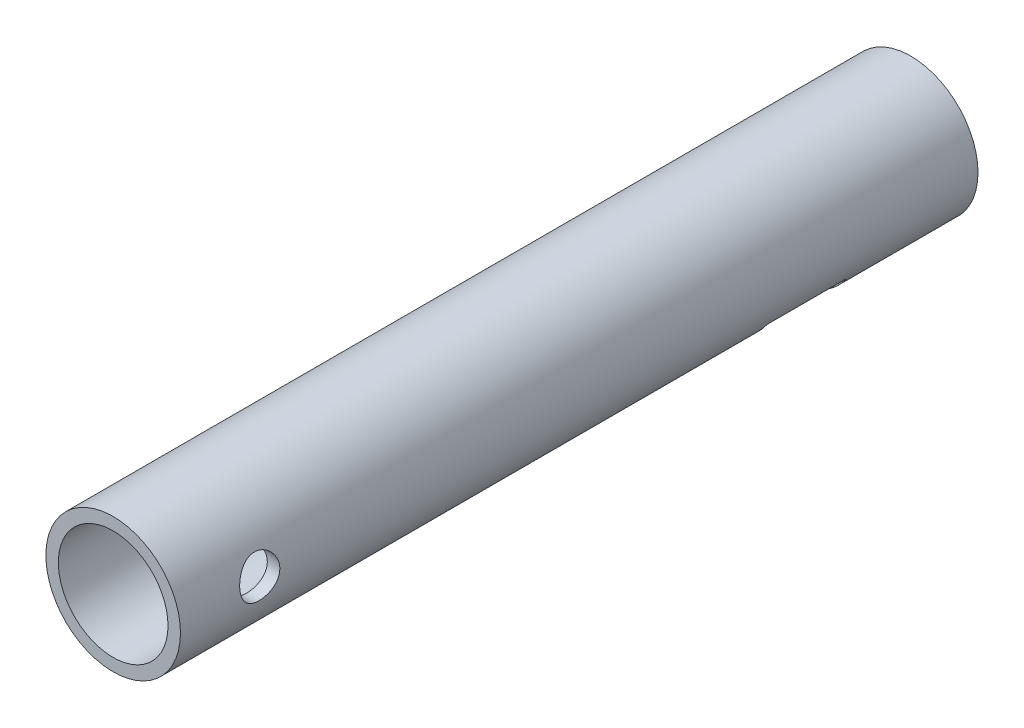
ISO-10303-21;
HEADER;
FILE_DESCRIPTION(('STEP AP214'),'2;1');
FILE_NAME('part.step','',(''),(''),'','','');
FILE_SCHEMA(('AUTOMOTIVE_DESIGN { 1 0 10303 214 1 1 1 1 }'));
ENDSEC;
DATA;
#1=APPLICATION_CONTEXT('core data for automotive mechanical design processes');
#2=APPLICATION_PROTOCOL_DEFINITION('international standard','automotive_design',2000,#1);
#3=PRODUCT_CONTEXT('',#1,'mechanical');
#4=PRODUCT('Part','Part','',(#3));
#5=PRODUCT_RELATED_PRODUCT_CATEGORY('part','',(#4));
#6=PRODUCT_DEFINITION_FORMATION('','',#4);
#7=PRODUCT_DEFINITION_CONTEXT('part definition',#1,'design');
#8=PRODUCT_DEFINITION('design','',#6,#7);
#9=PRODUCT_DEFINITION_SHAPE('','',#8);
#10=(LENGTH_UNIT() NAMED_UNIT(*) SI_UNIT(.MILLI.,.METRE.));
#11=(NAMED_UNIT(*) PLANE_ANGLE_UNIT() SI_UNIT($,.RADIAN.));
#12=(NAMED_UNIT(*) SI_UNIT($,.STERADIAN.) SOLID_ANGLE_UNIT());
#13=UNCERTAINTY_MEASURE_WITH_UNIT(LENGTH_MEASURE(1.E-05),#10,'distance_accuracy_value','');
#14=(GEOMETRIC_REPRESENTATION_CONTEXT(3) GLOBAL_UNCERTAINTY_ASSIGNED_CONTEXT((#13)) GLOBAL_UNIT_ASSIGNED_CONTEXT((#10,
#11,#12)) REPRESENTATION_CONTEXT('',''));
#15=CARTESIAN_POINT('',(0.,0.,0.));
#16=DIRECTION('',(0.,0.,1.));
#17=DIRECTION('',(1.,0.,0.));
#18=AXIS2_PLACEMENT_3D('',#15,#16,#17);
#19=CARTESIAN_POINT('',(0.,0.,127.));
#20=DIRECTION('',(0.,0.,1.));
#21=DIRECTION('',(1.,0.,0.));
#22=AXIS2_PLACEMENT_3D('',#19,#20,#21);
#23=PLANE('',#22);
#24=CARTESIAN_POINT('',(0.,0.,127.));
#25=DIRECTION('',(0.,0.,1.));
#26=DIRECTION('',(1.,0.,0.));
#27=AXIS2_PLACEMENT_3D('',#24,#25,#26);
#28=CIRCLE('',#27,10.715625);
#29=CARTESIAN_POINT('',(10.715625,0.,127.));
#30=VERTEX_POINT('',#29);
#31=EDGE_CURVE('E146',#30,#30,#28,.T.);
#32=ORIENTED_EDGE('',*,*,#31,.T.);
#33=EDGE_LOOP('',(#32));
#34=FACE_BOUND('',#33,.T.);
#35=CARTESIAN_POINT('',(0.,0.,127.));
#36=DIRECTION('',(0.,0.,1.));
#37=DIRECTION('',(1.,0.,0.));
#38=AXIS2_PLACEMENT_3D('',#35,#36,#37);
#39=CIRCLE('',#38,8.73125);
#40=CARTESIAN_POINT('',(8.73125,0.,127.));
#41=VERTEX_POINT('',#40);
#42=EDGE_CURVE('E140',#41,#41,#39,.T.);
#43=ORIENTED_EDGE('',*,*,#42,.F.);
#44=EDGE_LOOP('',(#43));
#45=FACE_BOUND('',#44,.T.);
#46=ADVANCED_FACE('F33',(#34,#45),#23,.T.);
#47=CARTESIAN_POINT('',(0.,0.,0.));
#48=DIRECTION('',(0.,0.,1.));
#49=DIRECTION('',(1.,0.,0.));
#50=AXIS2_PLACEMENT_3D('',#47,#48,#49);
#51=PLANE('',#50);
#52=CARTESIAN_POINT('',(0.,0.,0.));
#53=DIRECTION('',(0.,0.,1.));
#54=DIRECTION('',(1.,0.,0.));
#55=AXIS2_PLACEMENT_3D('',#52,#53,#54);
#56=CIRCLE('',#55,10.715625);
#57=CARTESIAN_POINT('',(10.715625,0.,0.));
#58=VERTEX_POINT('',#57);
#59=EDGE_CURVE('E143',#58,#58,#56,.T.);
#60=ORIENTED_EDGE('',*,*,#59,.F.);
#61=EDGE_LOOP('',(#60));
#62=FACE_BOUND('',#61,.T.);
#63=CARTESIAN_POINT('',(0.,0.,0.));
#64=DIRECTION('',(0.,0.,1.));
#65=DIRECTION('',(1.,0.,0.));
#66=AXIS2_PLACEMENT_3D('',#63,#64,#65);
#67=CIRCLE('',#66,8.73125);
#68=CARTESIAN_POINT('',(8.73125,0.,0.));
#69=VERTEX_POINT('',#68);
#70=EDGE_CURVE('E139',#69,#69,#67,.T.);
#71=ORIENTED_EDGE('',*,*,#70,.T.);
#72=EDGE_LOOP('',(#71));
#73=FACE_BOUND('',#72,.T.);
#74=ADVANCED_FACE('F196',(#62,#73),#51,.F.);
#75=CARTESIAN_POINT('',(0.,0.,127.));
#76=DIRECTION('',(0.,0.,-1.));
#77=DIRECTION('',(-1.,0.,0.));
#78=AXIS2_PLACEMENT_3D('',#75,#76,#77);
#79=CYLINDRICAL_SURFACE('',#78,10.715625);
#80=CARTESIAN_POINT('',(-10.715625,0.,117.243303774566));
#81=CARTESIAN_POINT('',(-10.7156241985774,-0.164005580794668,117.176957069357));
#82=CARTESIAN_POINT('',(-10.7118297163916,-0.322479936848455,117.096852098421));
#83=CARTESIAN_POINT('',(-10.6985206978598,-0.623760945674024,116.91150296186));
#84=CARTESIAN_POINT('',(-10.6890031492187,-0.766559300655177,116.806245575036));
#85=CARTESIAN_POINT('',(-10.6666121011843,-1.03237755156086,116.573768851958));
#86=CARTESIAN_POINT('',(-10.6537424401657,-1.15541981062583,116.446574690577));
#87=CARTESIAN_POINT('',(-10.6271610594934,-1.37867229506016,116.173613362715));
#88=CARTESIAN_POINT('',(-10.613449367351,-1.47888326587963,116.027846802872));
#89=CARTESIAN_POINT('',(-10.5874219168771,-1.65504970319443,115.719415962728));
#90=CARTESIAN_POINT('',(-10.5751287820095,-1.73063998281286,115.556540867311));
#91=CARTESIAN_POINT('',(-10.554312821636,-1.85337649886274,115.220175881309));
#92=CARTESIAN_POINT('',(-10.5457896952211,-1.90052500552782,115.046686839151));
#93=CARTESIAN_POINT('',(-10.5340294183002,-1.96466613249943,114.69544937312));
#94=CARTESIAN_POINT('',(-10.530751274355,-1.98189270667268,114.517745108408));
#95=CARTESIAN_POINT('',(-10.5299103946145,-1.98635711248558,114.161954622028));
#96=CARTESIAN_POINT('',(-10.5323472574381,-1.97359705017064,113.983868428061));
#97=CARTESIAN_POINT('',(-10.5424535052871,-1.91886361507665,113.634775581819));
#98=CARTESIAN_POINT('',(-10.5500549179061,-1.87726959315232,113.463707207204));
#99=CARTESIAN_POINT('',(-10.5691599498105,-1.76652512855174,113.130965861184));
#100=CARTESIAN_POINT('',(-10.5806639230973,-1.69737218590556,112.969293743672));
#101=CARTESIAN_POINT('',(-10.6057874217165,-1.53260554061405,112.658059833053));
#102=CARTESIAN_POINT('',(-10.6194277201464,-1.43672391725184,112.508641602656));
#103=CARTESIAN_POINT('',(-10.6463376423025,-1.22141455095845,112.227802539442));
#104=CARTESIAN_POINT('',(-10.6596072314099,-1.10198461728953,112.096383383037));
#105=CARTESIAN_POINT('',(-10.6833606587824,-0.841259986641432,111.853750990315));
#106=CARTESIAN_POINT('',(-10.6938109921598,-0.699731411092446,111.742785352109));
#107=CARTESIAN_POINT('',(-10.709215961757,-0.399774751542727,111.546203770478));
#108=CARTESIAN_POINT('',(-10.7141714393202,-0.241349258782689,111.460583947708));
#109=CARTESIAN_POINT('',(-10.7165069838976,0.0847977145378336,111.318585039758));
#110=CARTESIAN_POINT('',(-10.7140209650604,0.252302233877439,111.26171032528));
#111=CARTESIAN_POINT('',(-10.7005092825232,0.594084708564561,111.176577623808));
#112=CARTESIAN_POINT('',(-10.689485156274,0.768361439079026,111.148314486863));
#113=CARTESIAN_POINT('',(-10.6589186530186,1.11422933910506,111.121294076534));
#114=CARTESIAN_POINT('',(-10.6395842808478,1.28578630997922,111.121853606921));
#115=CARTESIAN_POINT('',(-10.5930050024699,1.62550702645259,111.150306788304));
#116=CARTESIAN_POINT('',(-10.5657595077408,1.79367051860939,111.178202473251));
#117=CARTESIAN_POINT('',(-10.5042281647614,2.12476067371002,111.26066281959));
#118=CARTESIAN_POINT('',(-10.4698412948703,2.2875683789566,111.315627664323));
#119=CARTESIAN_POINT('',(-10.3963262929359,2.601350395268,111.450497351538));
#120=CARTESIAN_POINT('',(-10.3571968663043,2.7523214566474,111.530409013241));
#121=CARTESIAN_POINT('',(-10.2746494733951,3.04642417890097,111.717647616606));
#122=CARTESIAN_POINT('',(-10.231114639436,3.18876881951864,111.826160345627));
#123=CARTESIAN_POINT('',(-10.1448415972497,3.45343593700421,112.065680293023));
#124=CARTESIAN_POINT('',(-10.1021036531434,3.5757518765387,112.196694827474));
#125=CARTESIAN_POINT('',(-10.0198737612212,3.80018962209496,112.482134456363));
#126=CARTESIAN_POINT('',(-9.980501479454,3.90167283093683,112.637098673707));
#127=CARTESIAN_POINT('',(-9.91028979071552,4.07672921315628,112.963836634003));
#128=CARTESIAN_POINT('',(-9.87944668631345,4.15031448554374,113.135603049284));
#129=CARTESIAN_POINT('',(-9.83106627740892,4.26361217929916,113.482125548724));
#130=CARTESIAN_POINT('',(-9.81294155729113,4.30483229148096,113.656304244579));
#131=CARTESIAN_POINT('',(-9.7897222546154,4.35738728496238,114.009928529772));
#132=CARTESIAN_POINT('',(-9.78461995146149,4.36873987393354,114.189370934552));
#133=CARTESIAN_POINT('',(-9.78792222258104,4.36132744271024,114.533901101351));
#134=CARTESIAN_POINT('',(-9.79533757607064,4.34476832443281,114.699051234494));
#135=CARTESIAN_POINT('',(-9.82102084183149,4.28639376310044,115.023935363059));
#136=CARTESIAN_POINT('',(-9.83928938063137,4.24457686197131,115.183669045239));
#137=CARTESIAN_POINT('',(-9.88489138772368,4.1372588272953,115.493702235801));
#138=CARTESIAN_POINT('',(-9.91223317076353,4.07173596454674,115.643992939805));
#139=CARTESIAN_POINT('',(-9.97355617533892,3.91912498019044,115.931702787427));
#140=CARTESIAN_POINT('',(-10.0075394000351,3.83203035008255,116.069118029061));
#141=CARTESIAN_POINT('',(-10.0821488404631,3.63141099195491,116.337976968128));
#142=CARTESIAN_POINT('',(-10.1230798766,3.51641294586824,116.468237073853));
#143=CARTESIAN_POINT('',(-10.2062987748946,3.26701098312701,116.708155032649));
#144=CARTESIAN_POINT('',(-10.2485871258412,3.13260001320419,116.817805364133));
#145=CARTESIAN_POINT('',(-10.3338275952269,2.83922947904785,117.019592249049));
#146=CARTESIAN_POINT('',(-10.3766809066944,2.67930902510741,117.110379707206));
#147=CARTESIAN_POINT('',(-10.4572749421912,2.34510738405432,117.263368757677));
#148=CARTESIAN_POINT('',(-10.4950158908494,2.17082682844276,117.325571606239));
#149=CARTESIAN_POINT('',(-10.5621850465784,1.81574757343737,117.418160471105));
#150=CARTESIAN_POINT('',(-10.5917448031183,1.63511207393768,117.44907421632));
#151=CARTESIAN_POINT('',(-10.641687655936,1.27002521673559,117.47927803233));
#152=CARTESIAN_POINT('',(-10.6620775001128,1.08557676977439,117.478591395597));
#153=CARTESIAN_POINT('',(-10.690615869301,0.747939102896874,117.447807679126));
#154=CARTESIAN_POINT('',(-10.7001919495098,0.594426913755052,117.422387071235));
#155=CARTESIAN_POINT('',(-10.7126967562218,0.292519442469018,117.349286658032));
#156=CARTESIAN_POINT('',(-10.71562570427,0.144123989949184,117.301607594646));
#157=CARTESIAN_POINT('',(-10.715625,0.,117.243303774566));
#158=B_SPLINE_CURVE_WITH_KNOTS('',3,(#80,#81,#82,#83,#84,#85,#86,#87,#88,#89,#90,#91,#92,#93,
#94,#95,#96,#97,#98,#99,#100,#101,#102,#103,#104,#105,#106,#107,#108,#109,#110,#111,#112,#113,
#114,#115,#116,#117,#118,#119,#120,#121,#122,#123,#124,#125,#126,#127,#128,#129,#130,#131,#132,
#133,#134,#135,#136,#137,#138,#139,#140,#141,#142,#143,#144,#145,#146,#147,#148,#149,#150,#151,
#152,#153,#154,#155,#156,#157),.UNSPECIFIED.,.T.,.F.,(4,2,2,2,2,2,2,2,2,2,2,2,2,2,2,2,2,2,2,2,2,
2,2,2,2,2,2,2,2,2,2,2,2,2,2,2,2,2,4),(0.,0.53017381019819,1.06062691813643,1.5904752746858,
2.12030632900758,2.65767177845071,3.19499432949236,3.72809642213632,4.26116107464706,
4.78734241319247,5.31357149442992,5.84527774083405,6.37703347609704,6.91485515450411,
7.45259447309401,7.98071537501116,8.50874120068148,9.0242568938436,9.53981094692406,
10.0632265790751,10.586785412541,11.1369224344399,11.6872386637184,12.2524993544245,
12.8175146169629,13.3543214833164,13.8908100191562,14.3868553373004,14.8829292937465,
15.3794591150304,15.8761389291011,16.4093689397743,16.9427931777571,17.5065257792397,
18.0702336031855,18.6242668967324,19.1778918218548,19.6438107946878,20.1097142384736),.UNSPECIFIED.);
#159=CARTESIAN_POINT('',(-10.715625,0.,117.243303774566));
#160=VERTEX_POINT('',#159);
#161=EDGE_CURVE('E118',#160,#160,#158,.T.);
#162=ORIENTED_EDGE('',*,*,#161,.T.);
#163=EDGE_LOOP('',(#162));
#164=FACE_BOUND('',#163,.T.);
#165=CARTESIAN_POINT('',(10.6492737428427,1.190625,111.125));
#166=CARTESIAN_POINT('',(10.6684597795728,1.01902389291595,111.124999816036));
#167=CARTESIAN_POINT('',(10.6834603351592,0.846951327018768,111.138953388063));
#168=CARTESIAN_POINT('',(10.704988617735,0.506831504453065,111.194723031247));
#169=CARTESIAN_POINT('',(10.7115163878406,0.338784227304908,111.236538960617));
#170=CARTESIAN_POINT('',(10.71686747514,0.0117033823030918,111.3469417703));
#171=CARTESIAN_POINT('',(10.7156944095821,-0.147334382108545,111.415516067396));
#172=CARTESIAN_POINT('',(10.7071725646237,-0.452037946538933,111.577489146024));
#173=CARTESIAN_POINT('',(10.699822928326,-0.597701888050279,111.670891370791));
#174=CARTESIAN_POINT('',(10.6808866815742,-0.87326241479311,111.881044793832));
#175=CARTESIAN_POINT('',(10.669255155706,-1.00297166039658,111.998037336438));
#176=CARTESIAN_POINT('',(10.644148559628,-1.24142105145872,112.251568485501));
#177=CARTESIAN_POINT('',(10.6306732504656,-1.35015847457914,112.388109625545));
#178=CARTESIAN_POINT('',(10.6039428551835,-1.54631578920649,112.680864221433));
#179=CARTESIAN_POINT('',(10.590702024935,-1.63312499795554,112.837488819062));
#180=CARTESIAN_POINT('',(10.5671322804776,-1.77928237848225,113.163273945758));
#181=CARTESIAN_POINT('',(10.5568032623005,-1.8386315307884,113.332434026966));
#182=CARTESIAN_POINT('',(10.5408501907935,-1.92799763261565,113.678200709895));
#183=CARTESIAN_POINT('',(10.5352168176278,-1.95807270483874,113.854791826877));
#184=CARTESIAN_POINT('',(10.5295865331726,-1.98813260562761,114.210596823416));
#185=CARTESIAN_POINT('',(10.5295890365202,-1.98812055915212,114.389810428659));
#186=CARTESIAN_POINT('',(10.5351832984706,-1.95825037575942,114.742843944138));
#187=CARTESIAN_POINT('',(10.5406889307776,-1.92885214474069,114.91670441381));
#188=CARTESIAN_POINT('',(10.5562446049504,-1.84180721537006,115.256989084194));
#189=CARTESIAN_POINT('',(10.5662949384738,-1.78415870402778,115.423412806898));
#190=CARTESIAN_POINT('',(10.5893337684337,-1.6418959398665,115.745188712838));
#191=CARTESIAN_POINT('',(10.6023383176566,-1.55713328544366,115.900474068758));
#192=CARTESIAN_POINT('',(10.6290273094541,-1.36307050472235,116.194821013496));
#193=CARTESIAN_POINT('',(10.6427118306789,-1.25376753474847,116.333880719282));
#194=CARTESIAN_POINT('',(10.6684587949197,-1.01173137296272,116.593962994215));
#195=CARTESIAN_POINT('',(10.6804942901197,-0.878675917640587,116.714688770457));
#196=CARTESIAN_POINT('',(10.7001032809595,-0.593915026071391,116.932132999955));
#197=CARTESIAN_POINT('',(10.7076772085725,-0.442211397077438,117.028853776871));
#198=CARTESIAN_POINT('',(10.7160302338008,-0.12633063005902,117.194422081132));
#199=CARTESIAN_POINT('',(10.7168867230462,0.0376823901968681,117.263578338542));
#200=CARTESIAN_POINT('',(10.7103936059364,0.374790995259556,117.373508595373));
#201=CARTESIAN_POINT('',(10.7030457465982,0.547884638978937,117.414288634165));
#202=CARTESIAN_POINT('',(10.6797028153934,0.893143499428131,117.465719703148));
#203=CARTESIAN_POINT('',(10.6639442880613,1.06520971645472,117.477147422491));
#204=CARTESIAN_POINT('',(10.6241258025359,1.40795594328694,117.472187307427));
#205=CARTESIAN_POINT('',(10.6000656674281,1.57863592347131,117.455798880203));
#206=CARTESIAN_POINT('',(10.5445372208162,1.91482169800423,117.396040450648));
#207=CARTESIAN_POINT('',(10.5130326445395,2.08029752193365,117.3525366034));
#208=CARTESIAN_POINT('',(10.4444304597753,2.40113269740859,117.240104138033));
#209=CARTESIAN_POINT('',(10.4073315467452,2.55648967721091,117.171169584293));
#210=CARTESIAN_POINT('',(10.327997275848,2.86058215998735,117.006136949238));
#211=CARTESIAN_POINT('',(10.2856029006894,3.00866894055899,116.908920000291));
#212=CARTESIAN_POINT('',(10.2001948898507,3.2866122663445,116.69136596399));
#213=CARTESIAN_POINT('',(10.1571810353746,3.41646218721921,116.571020512861));
#214=CARTESIAN_POINT('',(10.0722727577141,3.65939115960504,116.304870596457));
#215=CARTESIAN_POINT('',(10.0304849415164,3.77163356354058,116.158265249706));
#216=CARTESIAN_POINT('',(9.95378206719121,3.96965500272802,115.846508836706));
#217=CARTESIAN_POINT('',(9.91886544267823,4.05544007183944,115.681362010762));
#218=CARTESIAN_POINT('',(9.86066510451753,4.19493275586281,115.342671115479));
#219=CARTESIAN_POINT('',(9.83703230646643,4.24961463380909,115.169590694693));
#220=CARTESIAN_POINT('',(9.80247585474579,4.32874159987422,114.815463239812));
#221=CARTESIAN_POINT('',(9.79154332153465,4.35320781439055,114.634421863737));
#222=CARTESIAN_POINT('',(9.78404978499962,4.37001613763964,114.285065413123));
#223=CARTESIAN_POINT('',(9.78641391727409,4.36476066294223,114.116884637173));
#224=CARTESIAN_POINT('',(9.80277418887304,4.32789059574104,113.784034428761));
#225=CARTESIAN_POINT('',(9.81676983271169,4.29627712605012,113.619364847034));
#226=CARTESIAN_POINT('',(9.85453788321843,4.20890551124494,113.301361782153));
#227=CARTESIAN_POINT('',(9.87811118600856,4.15363791570463,113.14786838401));
#228=CARTESIAN_POINT('',(9.93284959939,4.02097579525906,112.852239902542));
#229=CARTESIAN_POINT('',(9.96401663746049,3.94357565169436,112.710107715159));
#230=CARTESIAN_POINT('',(10.0335943422918,3.76317883904583,112.431336314447));
#231=CARTESIAN_POINT('',(10.0723424255413,3.65885385127136,112.295641706782));
#232=CARTESIAN_POINT('',(10.1524638144846,3.43027085546361,112.04308902644));
#233=CARTESIAN_POINT('',(10.1938382459623,3.30600426411101,111.926239108563));
#234=CARTESIAN_POINT('',(10.2790205230097,3.03123609477751,111.706591411866));
#235=CARTESIAN_POINT('',(10.3228022783673,2.87952442590192,111.605291806873));
#236=CARTESIAN_POINT('',(10.4065929005101,2.56020462028539,111.429799754501));
#237=CARTESIAN_POINT('',(10.4466023903529,2.39259911790217,111.355602824788));
#238=CARTESIAN_POINT('',(10.5180346974094,2.05515983107309,111.240053874128));
#239=CARTESIAN_POINT('',(10.5498038935596,1.88593209917207,111.197148271899));
#240=CARTESIAN_POINT('',(10.6056004382047,1.54150778433364,111.139626780161));
#241=CARTESIAN_POINT('',(10.6296307126552,1.36631348502212,111.125000188346));
#242=CARTESIAN_POINT('',(10.6492737428427,1.190625,111.125));
#243=B_SPLINE_CURVE_WITH_KNOTS('',3,(#165,#166,#167,#168,#169,#170,#171,#172,#173,#174,#175,
#176,#177,#178,#179,#180,#181,#182,#183,#184,#185,#186,#187,#188,#189,#190,#191,#192,#193,#194,
#195,#196,#197,#198,#199,#200,#201,#202,#203,#204,#205,#206,#207,#208,#209,#210,#211,#212,#213,
#214,#215,#216,#217,#218,#219,#220,#221,#222,#223,#224,#225,#226,#227,#228,#229,#230,#231,#232,
#233,#234,#235,#236,#237,#238,#239,#240,#241,#242),.UNSPECIFIED.,.T.,.F.,(4,2,2,2,2,2,2,2,2,2,2,
2,2,2,2,2,2,2,2,2,2,2,2,2,2,2,2,2,2,2,2,2,2,2,2,2,2,2,4),(0.,0.517391199024268,1.03477976513479,
1.55192532008764,2.0691426322866,2.59194758518368,3.11482035743293,3.65095587032009,
4.18707223769989,4.72212197954738,5.2571161491646,5.78386651061985,6.31065068124146,
6.84036885884796,7.37014845069001,7.90775403822122,8.44530756572085,8.97665870611345,
9.507896723282,10.0249256662276,10.5419656281881,11.0615781956148,11.581312119326,
12.1253344103613,12.6695538032482,13.2346951203863,13.7997074559319,14.345878944919,
14.8916683413359,15.3940059491243,15.8963221591428,16.3886907032697,16.8811843532337,
17.4054232401963,17.9298883797133,18.4900576724341,19.0501342804318,19.5800498420732,
20.1097648157407),.UNSPECIFIED.);
#244=CARTESIAN_POINT('',(10.6492737428427,1.190625,111.125));
#245=VERTEX_POINT('',#244);
#246=EDGE_CURVE('E121',#245,#245,#243,.T.);
#247=ORIENTED_EDGE('',*,*,#246,.T.);
#248=EDGE_LOOP('',(#247));
#249=FACE_BOUND('',#248,.T.);
#250=DIRECTION('',(0.,0.,-1.));
#251=VECTOR('',#250,1.);
#252=CARTESIAN_POINT('',(8.89000000000002,-5.98268494412205,127.));
#253=LINE('',#252,#251);
#254=CARTESIAN_POINT('',(8.89000000000001,-5.98268494412207,31.75));
#255=VERTEX_POINT('',#254);
#256=CARTESIAN_POINT('',(8.89,-5.98268494412207,19.05));
#257=VERTEX_POINT('',#256);
#258=EDGE_CURVE('E11',#255,#257,#253,.T.);
#259=ORIENTED_EDGE('',*,*,#258,.T.);
#260=CARTESIAN_POINT('',(0.,0.,19.05));
#261=DIRECTION('',(0.,0.,-1.));
#262=DIRECTION('',(-1.,0.,0.));
#263=AXIS2_PLACEMENT_3D('',#260,#261,#262);
#264=CIRCLE('',#263,10.715625);
#265=CARTESIAN_POINT('',(-8.88999999999999,-5.98268494412209,19.05));
#266=VERTEX_POINT('',#265);
#267=EDGE_CURVE('E54',#257,#266,#264,.T.);
#268=ORIENTED_EDGE('',*,*,#267,.T.);
#269=DIRECTION('',(0.,0.,-1.));
#270=VECTOR('',#269,1.);
#271=CARTESIAN_POINT('',(-8.88999999999998,-5.98268494412211,127.));
#272=LINE('',#271,#270);
#273=CARTESIAN_POINT('',(-8.88999999999999,-5.98268494412211,31.75));
#274=VERTEX_POINT('',#273);
#275=EDGE_CURVE('E47',#266,#274,#272,.F.);
#276=ORIENTED_EDGE('',*,*,#275,.T.);
#277=CARTESIAN_POINT('',(0.,0.,31.75));
#278=DIRECTION('',(0.,0.,1.));
#279=DIRECTION('',(1.,0.,0.));
#280=AXIS2_PLACEMENT_3D('',#277,#278,#279);
#281=CIRCLE('',#280,10.715625);
#282=EDGE_CURVE('E137',#274,#255,#281,.T.);
#283=ORIENTED_EDGE('',*,*,#282,.T.);
#284=EDGE_LOOP('',(#259,#268,#276,#283));
#285=FACE_BOUND('',#284,.T.);
#286=ORIENTED_EDGE('',*,*,#31,.F.);
#287=EDGE_LOOP('',(#286));
#288=FACE_BOUND('',#287,.T.);
#289=ORIENTED_EDGE('',*,*,#59,.T.);
#290=EDGE_LOOP('',(#289));
#291=FACE_BOUND('',#290,.T.);
#292=ADVANCED_FACE('F35',(#164,#249,#285,#288,#291),#79,.T.);
#293=CARTESIAN_POINT('',(0.,0.,127.));
#294=DIRECTION('',(0.,0.,-1.));
#295=DIRECTION('',(-1.,0.,0.));
#296=AXIS2_PLACEMENT_3D('',#293,#294,#295);
#297=CYLINDRICAL_SURFACE('',#296,8.73125);
#298=CARTESIAN_POINT('',(-8.73125,0.,117.243303774566));
#299=CARTESIAN_POINT('',(-8.73125255604172,-0.16335083985687,117.177227927906));
#300=CARTESIAN_POINT('',(-8.72663212291829,-0.321161912287646,117.0975160865));
#301=CARTESIAN_POINT('',(-8.71042513804729,-0.621143958728068,116.913258014886));
#302=CARTESIAN_POINT('',(-8.69883738715884,-0.763312235481649,116.808707511583));
#303=CARTESIAN_POINT('',(-8.67154419071799,-1.02798618387594,116.577976072056));
#304=CARTESIAN_POINT('',(-8.65584474844837,-1.15052010569814,116.45182676343));
#305=CARTESIAN_POINT('',(-8.62334337021977,-1.37308133188052,116.181153818707));
#306=CARTESIAN_POINT('',(-8.60654135810916,-1.47310707954175,116.036628912808));
#307=CARTESIAN_POINT('',(-8.57442403567787,-1.64992660189193,115.729658310242));
#308=CARTESIAN_POINT('',(-8.55914809783182,-1.72617912118032,115.566896028194));
#309=CARTESIAN_POINT('',(-8.53319292354115,-1.85024153505364,115.230525268453));
#310=CARTESIAN_POINT('',(-8.52251305544175,-1.89805533842133,115.056918284946));
#311=CARTESIAN_POINT('',(-8.50771390643589,-1.96332727007723,114.70585529034));
#312=CARTESIAN_POINT('',(-8.50352125174773,-1.98112510503044,114.528465684335));
#313=CARTESIAN_POINT('',(-8.50219509622634,-1.98681110176856,114.173193120793));
#314=CARTESIAN_POINT('',(-8.50506083268261,-1.97470249516162,113.995310218633));
#315=CARTESIAN_POINT('',(-8.51722504961764,-1.92153811177084,113.647807492874));
#316=CARTESIAN_POINT('',(-8.52639445988803,-1.88106283600883,113.478093691226));
#317=CARTESIAN_POINT('',(-8.54950563663226,-1.77305021381489,113.147851380647));
#318=CARTESIAN_POINT('',(-8.56344803769645,-1.70550926867811,112.987324096419));
#319=CARTESIAN_POINT('',(-8.59404088319122,-1.54402622334647,112.677243733443));
#320=CARTESIAN_POINT('',(-8.61072989505783,-1.44969174684039,112.527898918205));
#321=CARTESIAN_POINT('',(-8.64376249488478,-1.2375742637521,112.246836979547));
#322=CARTESIAN_POINT('',(-8.66010603247907,-1.11978786388497,112.115122411684));
#323=CARTESIAN_POINT('',(-8.68963273065754,-0.861493320280808,111.870678727886));
#324=CARTESIAN_POINT('',(-8.70275459526819,-0.720618727648966,111.758328418618));
#325=CARTESIAN_POINT('',(-8.72235047578815,-0.421580707948718,111.558887837638));
#326=CARTESIAN_POINT('',(-8.72882600815163,-0.263421233785583,111.471791807064));
#327=CARTESIAN_POINT('',(-8.73250388719911,0.0612240696907007,111.327490785663));
#328=CARTESIAN_POINT('',(-8.72994129975813,0.227389565540857,111.269572216798));
#329=CARTESIAN_POINT('',(-8.71450185860544,0.566530566151024,111.182022795104));
#330=CARTESIAN_POINT('',(-8.70162773092712,0.739504259556153,111.152384470443));
#331=CARTESIAN_POINT('',(-8.66575267835032,1.08067166594022,111.122448930303));
#332=CARTESIAN_POINT('',(-8.64312505203331,1.24881871931768,111.121153448139));
#333=CARTESIAN_POINT('',(-8.58844973803623,1.58168238598151,111.144758342166));
#334=CARTESIAN_POINT('',(-8.55640113167028,1.74639866303784,111.169661273704));
#335=CARTESIAN_POINT('',(-8.48364376671614,2.07142626792836,111.244971850122));
#336=CARTESIAN_POINT('',(-8.44277722209171,2.23158745441053,111.295871009697));
#337=CARTESIAN_POINT('',(-8.3550155917744,2.54052558469224,111.421419245012));
#338=CARTESIAN_POINT('',(-8.3081185907644,2.68929888756434,111.496075877457));
#339=CARTESIAN_POINT('',(-8.20742057917486,2.98308976448569,111.673357500771));
#340=CARTESIAN_POINT('',(-8.15336547307355,3.12702241508622,111.777638271598));
#341=CARTESIAN_POINT('',(-8.0452205204776,3.39560881158552,112.008687289753));
#342=CARTESIAN_POINT('',(-7.99113067318539,3.52025057176041,112.135469413347));
#343=CARTESIAN_POINT('',(-7.88449555745389,3.75322442438102,112.41623358073));
#344=CARTESIAN_POINT('',(-7.83216899271981,3.86040364497394,112.57127152689));
#345=CARTESIAN_POINT('',(-7.76128235622021,3.99999532298088,112.81776706677));
#346=CARTESIAN_POINT('',(-7.73891342043349,4.04300903071054,112.902291134386));
#347=CARTESIAN_POINT('',(-7.69738007707712,4.12153316801428,113.075490079297));
#348=CARTESIAN_POINT('',(-7.67821377318067,4.15704804106969,113.164162460211));
#349=CARTESIAN_POINT('',(-7.64485287070233,4.21806628292697,113.339142839752));
#350=CARTESIAN_POINT('',(-7.6304162619202,4.24406997287043,113.425230520858));
#351=CARTESIAN_POINT('',(-7.60538754244659,4.28876007869082,113.599789202037));
#352=CARTESIAN_POINT('',(-7.59479332583782,4.30745050322653,113.688258867956));
#353=CARTESIAN_POINT('',(-7.57782410681338,4.33723494422386,113.866812231295));
#354=CARTESIAN_POINT('',(-7.57144609635366,4.3483343766599,113.956894730811));
#355=CARTESIAN_POINT('',(-7.56312835923825,4.36278279085327,114.137851235724));
#356=CARTESIAN_POINT('',(-7.56118811668231,4.36613267351327,114.228725147883));
#357=CARTESIAN_POINT('',(-7.56209944667647,4.36456890490865,114.478838781792));
#358=CARTESIAN_POINT('',(-7.56965079206958,4.35154823448112,114.638107889583));
#359=CARTESIAN_POINT('',(-7.59786180888191,4.30209075362364,114.951657940752));
#360=CARTESIAN_POINT('',(-7.618523321228,4.26565065463325,115.105938180395));
#361=CARTESIAN_POINT('',(-7.67051465248367,4.17142376337521,115.40442624953));
#362=CARTESIAN_POINT('',(-7.70175474176231,4.11381617919904,115.548706887397));
#363=CARTESIAN_POINT('',(-7.77214442712764,3.97922717605538,115.825805085392));
#364=CARTESIAN_POINT('',(-7.81129670916424,3.90223917583723,115.958618730913));
#365=CARTESIAN_POINT('',(-7.89926039880716,3.72123842916552,116.224932835377));
#366=CARTESIAN_POINT('',(-7.94866276981218,3.61516167244093,116.356835324548));
#367=CARTESIAN_POINT('',(-8.04980139860167,3.38398474086376,116.601780596675));
#368=CARTESIAN_POINT('',(-8.10153902310127,3.25887332165724,116.71481214867));
#369=CARTESIAN_POINT('',(-8.20880670131386,2.97905204253061,116.929869969892));
#370=CARTESIAN_POINT('',(-8.26421784418925,2.82264832668779,117.029765333263));
#371=CARTESIAN_POINT('',(-8.36946246379683,2.49332624682346,117.201388339102));
#372=CARTESIAN_POINT('',(-8.41929631515812,2.32040899347124,117.273117874292));
#373=CARTESIAN_POINT('',(-8.50918675682429,1.96507529591009,117.384637499408));
#374=CARTESIAN_POINT('',(-8.54937751375841,1.78283798296368,117.424885942024));
#375=CARTESIAN_POINT('',(-8.61837222099245,1.41204470320102,117.472772504973));
#376=CARTESIAN_POINT('',(-8.64718283844607,1.22349250646899,117.480429744931));
#377=CARTESIAN_POINT('',(-8.69074970023947,0.858608040187274,117.462531158158));
#378=CARTESIAN_POINT('',(-8.70628646310391,0.682264911572946,117.439066640963));
#379=CARTESIAN_POINT('',(-8.7265349981718,0.33540013987553,117.362798892061));
#380=CARTESIAN_POINT('',(-8.73124742005963,0.164878148009056,117.309997421413));
#381=CARTESIAN_POINT('',(-8.73125,0.,117.243303774566));
#382=B_SPLINE_CURVE_WITH_KNOTS('',3,(#298,#299,#300,#301,#302,#303,#304,#305,#306,#307,#308,
#309,#310,#311,#312,#313,#314,#315,#316,#317,#318,#319,#320,#321,#322,#323,#324,#325,#326,#327,
#328,#329,#330,#331,#332,#333,#334,#335,#336,#337,#338,#339,#340,#341,#342,#343,#344,#345,#346,
#347,#348,#349,#350,#351,#352,#353,#354,#355,#356,#357,#358,#359,#360,#361,#362,#363,#364,#365,
#366,#367,#368,#369,#370,#371,#372,#373,#374,#375,#376,#377,#378,#379,#380,#381),.UNSPECIFIED.,
.T.,.F.,(4,2,2,2,2,2,2,2,2,2,2,2,2,2,2,2,2,2,2,2,2,2,2,2,2,2,2,2,2,2,2,2,2,2,2,2,2,2,2,2,2,4),
(0.,0.527953912240133,1.05599871633109,1.58327680450126,2.11059134881118,2.64915751637452,
3.18764964315096,3.72000542803591,4.25230369052979,4.77401541791079,5.29579653614213,
5.82565206364837,6.35558431232709,6.89492994806248,7.43415249713067,7.95945537962816,
8.48461943507391,8.99125565377308,9.49794129344727,10.0145825345554,10.5313882718798,
11.0862833118271,11.6415217443219,12.2250177277532,12.5169941730357,12.808797117277,
13.0816532154073,13.3543595412631,13.6268710947344,13.8993509665301,14.3767043516877,
14.8541247815451,15.3275930577361,15.8012223328851,16.328042573066,16.8551752390811,
17.4334378458441,18.0116615871127,18.5813012293336,19.1506066464649,19.6835288432243,
20.2164190527914),.UNSPECIFIED.);
#383=CARTESIAN_POINT('',(-8.73125,0.,117.243303774566));
#384=VERTEX_POINT('',#383);
#385=EDGE_CURVE('E38',#384,#384,#382,.T.);
#386=ORIENTED_EDGE('',*,*,#385,.F.);
#387=EDGE_LOOP('',(#386));
#388=FACE_BOUND('',#387,.T.);
#389=CARTESIAN_POINT('',(8.64969009108852,1.190625,111.125));
#390=CARTESIAN_POINT('',(8.67280930953066,1.02263445589261,111.125006147576));
#391=CARTESIAN_POINT('',(8.69102832388259,0.853689660513206,111.138402118315));
#392=CARTESIAN_POINT('',(8.71742822832776,0.519098438837014,111.192187627083));
#393=CARTESIAN_POINT('',(8.72558680507171,0.35346014311685,111.232636862237));
#394=CARTESIAN_POINT('',(8.73268378485606,0.0308500471208997,111.33953338628));
#395=CARTESIAN_POINT('',(8.73163598496149,-0.126134367028551,111.405941629225));
#396=CARTESIAN_POINT('',(8.72209482863992,-0.427207221613245,111.562835395432));
#397=CARTESIAN_POINT('',(8.7136038226142,-0.57129971720528,111.653313311739));
#398=CARTESIAN_POINT('',(8.69136787455949,-0.844988143899608,111.857363292575));
#399=CARTESIAN_POINT('',(8.67754630006125,-0.974335206927805,111.971260326875));
#400=CARTESIAN_POINT('',(8.64744181877221,-1.2128303014529,112.218288477186));
#401=CARTESIAN_POINT('',(8.63115818721372,-1.32197236399169,112.351425256381));
#402=CARTESIAN_POINT('',(8.59834736716118,-1.5211001014703,112.639004564009));
#403=CARTESIAN_POINT('',(8.58183458771863,-1.61019607980979,112.794066149734));
#404=CARTESIAN_POINT('',(8.55212125142553,-1.76122254914285,113.117197409847));
#405=CARTESIAN_POINT('',(8.53892051758644,-1.823154491856,113.28526638852));
#406=CARTESIAN_POINT('',(8.51813853865559,-1.91792056180934,113.629611663659));
#407=CARTESIAN_POINT('',(8.51055224637317,-1.95078082869729,113.805880436881));
#408=CARTESIAN_POINT('',(8.50231412025562,-1.98638620308222,114.161580065747));
#409=CARTESIAN_POINT('',(8.50166111677696,-1.9891363901421,114.341010382925));
#410=CARTESIAN_POINT('',(8.50732991864413,-1.96473907095542,114.693389325213));
#411=CARTESIAN_POINT('',(8.51348581589895,-1.93830276171874,114.866390495497));
#412=CARTESIAN_POINT('',(8.53147352934313,-1.85751956889657,115.205437423605));
#413=CARTESIAN_POINT('',(8.54330584773559,-1.80317021576435,115.371482564603));
#414=CARTESIAN_POINT('',(8.57077492741378,-1.66772956790989,115.693237365088));
#415=CARTESIAN_POINT('',(8.58643652240304,-1.58646243313486,115.848870753171));
#416=CARTESIAN_POINT('',(8.61888113004375,-1.39949649586701,116.144588884939));
#417=CARTESIAN_POINT('',(8.63566434081044,-1.29379336900073,116.284670870031));
#418=CARTESIAN_POINT('',(8.66775431768285,-1.05793258767054,116.548703051461));
#419=CARTESIAN_POINT('',(8.68301774676845,-0.927264047556402,116.672203089727));
#420=CARTESIAN_POINT('',(8.70840771703262,-0.646656727977616,116.89560569679));
#421=CARTESIAN_POINT('',(8.71853489207053,-0.496720329201611,116.995511176551));
#422=CARTESIAN_POINT('',(8.73068673939729,-0.184144497249737,117.16739812562));
#423=CARTESIAN_POINT('',(8.73282780027344,-0.0217230376476749,117.239766792782));
#424=CARTESIAN_POINT('',(8.72724696889707,0.312747699425071,117.35635345692));
#425=CARTESIAN_POINT('',(8.71952827119159,0.484793841246669,117.400580564766));
#426=CARTESIAN_POINT('',(8.69370223714571,0.826067235008082,117.458558023482));
#427=CARTESIAN_POINT('',(8.67602089034216,0.995133859089871,117.473452014429));
#428=CARTESIAN_POINT('',(8.63070421971124,1.33213325388237,117.476318520766));
#429=CARTESIAN_POINT('',(8.60306872254471,1.50006600479621,117.464290567326));
#430=CARTESIAN_POINT('',(8.53883944126372,1.83068331931109,117.414320051438));
#431=CARTESIAN_POINT('',(8.50222216778076,1.99335283492459,117.376309064088));
#432=CARTESIAN_POINT('',(8.42193484133465,2.3091831381661,117.276059085856));
#433=CARTESIAN_POINT('',(8.37826294550516,2.46234142668064,117.213813758271));
#434=CARTESIAN_POINT('',(8.28328833466803,2.76563284789425,117.062344734253));
#435=CARTESIAN_POINT('',(8.23167426541045,2.91492383633031,116.971631736123));
#436=CARTESIAN_POINT('',(8.12655070807139,3.19632660946275,116.76739508777));
#437=CARTESIAN_POINT('',(8.07304013950207,3.32842839410469,116.653858256342));
#438=CARTESIAN_POINT('',(7.96442782905103,3.58088457725368,116.398027037855));
#439=CARTESIAN_POINT('',(7.90945788276455,3.69986843777626,116.254319968035));
#440=CARTESIAN_POINT('',(7.8067921212492,3.91185883341194,115.946319910624));
#441=CARTESIAN_POINT('',(7.75909550150402,4.00486824255547,115.782029203496));
#442=CARTESIAN_POINT('',(7.69780005854778,4.12073128304117,115.526183383909));
#443=CARTESIAN_POINT('',(7.67930355444606,4.15502564267673,115.440822618393));
#444=CARTESIAN_POINT('',(7.64586689670347,4.21623811462837,115.266838455982));
#445=CARTESIAN_POINT('',(7.63092481909496,4.24316021865475,115.178216854274));
#446=CARTESIAN_POINT('',(7.60512538875063,4.28922985160341,114.998480909004));
#447=CARTESIAN_POINT('',(7.59426436574288,4.30838436749388,114.907368884695));
#448=CARTESIAN_POINT('',(7.57701645997726,4.33864658892884,114.723402189615));
#449=CARTESIAN_POINT('',(7.5706289025688,4.34975550785146,114.630547783786));
#450=CARTESIAN_POINT('',(7.56308564775533,4.362855583545,114.455769388459));
#451=CARTESIAN_POINT('',(7.56137264919326,4.36581833341063,114.37394058915));
#452=CARTESIAN_POINT('',(7.56160728984228,4.36541205051458,114.210275743604));
#453=CARTESIAN_POINT('',(7.56355608980623,4.36204101000584,114.128439703295));
#454=CARTESIAN_POINT('',(7.5710567976653,4.34900938566193,113.965470428912));
#455=CARTESIAN_POINT('',(7.576607151111,4.3393515152499,113.884336906928));
#456=CARTESIAN_POINT('',(7.59113575814566,4.31388379228,113.723342423729));
#457=CARTESIAN_POINT('',(7.60011533644139,4.29807156225272,113.643481966733));
#458=CARTESIAN_POINT('',(7.6308311784105,4.24345002966832,113.414151549506));
#459=CARTESIAN_POINT('',(7.65676064371194,4.19677432438119,113.267030455417));
#460=CARTESIAN_POINT('',(7.71773184053447,4.08355701447529,112.982790956831));
#461=CARTESIAN_POINT('',(7.75277616863715,4.017009748177,112.845675416926));
#462=CARTESIAN_POINT('',(7.832734871752,3.85895436150866,112.571430931402));
#463=CARTESIAN_POINT('',(7.87826422706055,3.76569983195459,112.435487902019));
#464=CARTESIAN_POINT('',(7.97325376718666,3.56016418028479,112.180382041616));
#465=CARTESIAN_POINT('',(8.02271607631952,3.44787273813874,112.061228376715));
#466=CARTESIAN_POINT('',(8.12788162024849,3.19270819482777,111.829106819344));
#467=CARTESIAN_POINT('',(8.18365430353959,3.04780891424422,111.718387355145));
#468=CARTESIAN_POINT('',(8.29172365634521,2.74018100597964,111.522823313063));
#469=CARTESIAN_POINT('',(8.34401890864879,2.57744517978548,111.437989234714));
#470=CARTESIAN_POINT('',(8.43823111929861,2.24905654497317,111.301687819337));
#471=CARTESIAN_POINT('',(8.4806025972504,2.08428683382559,111.248404575217));
#472=CARTESIAN_POINT('',(8.55650382458588,1.74662845747308,111.169284262406));
#473=CARTESIAN_POINT('',(8.59005920375858,1.57376508762344,111.143366958257));
#474=CARTESIAN_POINT('',(8.62401167043924,1.36469804457291,111.129583723295));
#475=CARTESIAN_POINT('',(8.62943717491848,1.32995431343397,111.127867583016));
#476=CARTESIAN_POINT('',(8.63987564600154,1.26036245160092,111.125574996786));
#477=CARTESIAN_POINT('',(8.64488855009123,1.22551430591264,111.124998723234));
#478=CARTESIAN_POINT('',(8.64969009108852,1.190625,111.125));
#479=B_SPLINE_CURVE_WITH_KNOTS('',3,(#389,#390,#391,#392,#393,#394,#395,#396,#397,#398,#399,
#400,#401,#402,#403,#404,#405,#406,#407,#408,#409,#410,#411,#412,#413,#414,#415,#416,#417,#418,
#419,#420,#421,#422,#423,#424,#425,#426,#427,#428,#429,#430,#431,#432,#433,#434,#435,#436,#437,
#438,#439,#440,#441,#442,#443,#444,#445,#446,#447,#448,#449,#450,#451,#452,#453,#454,#455,#456,
#457,#458,#459,#460,#461,#462,#463,#464,#465,#466,#467,#468,#469,#470,#471,#472,#473,#474,#475,
#476,#477,#478),.UNSPECIFIED.,.T.,.F.,(4,2,2,2,2,2,2,2,2,2,2,2,2,2,2,2,2,2,2,2,2,2,2,2,2,2,2,2,
2,2,2,2,2,2,2,2,2,2,2,2,2,2,2,2,4),(0.,0.508582770651654,1.01829152527759,1.52723653926703,
2.03602089745211,2.5524099422174,3.06895129596038,3.60519931503849,4.1414186720783,
4.67715539879222,5.21280174546205,5.73567830017545,6.2586011232422,6.78500961546328,
7.31151133622494,7.85023959346853,8.38890135067541,8.9196813435698,9.45028940815108,
9.95976504635173,10.4692495568672,10.9800809623233,11.4910460277915,12.0351885035433,
12.5796461396107,13.1604057700725,13.7411011149508,14.0222624980079,14.3032713437675,
14.5840268575658,14.8647400210482,15.1101224018688,15.3555825795293,15.6009368856891,
15.8463860680482,16.3137627070108,16.7812726352319,17.2922839189747,17.8035731162076,
18.3730684361454,18.9427944465301,19.4753480421725,20.0063358466275,20.1119454620024,
20.217571049213),.UNSPECIFIED.);
#480=CARTESIAN_POINT('',(8.64969009108852,1.190625,111.125));
#481=VERTEX_POINT('',#480);
#482=EDGE_CURVE('E158',#481,#481,#479,.T.);
#483=ORIENTED_EDGE('',*,*,#482,.F.);
#484=EDGE_LOOP('',(#483));
#485=FACE_BOUND('',#484,.T.);
#486=DIRECTION('',(0.,0.,-1.));
#487=VECTOR('',#486,1.);
#488=CARTESIAN_POINT('',(8.73125,0.,127.));
#489=LINE('',#488,#487);
#490=CARTESIAN_POINT('',(8.73125,0.,31.75));
#491=VERTEX_POINT('',#490);
#492=CARTESIAN_POINT('',(8.73125,0.,19.05));
#493=VERTEX_POINT('',#492);
#494=EDGE_CURVE('E111',#491,#493,#489,.T.);
#495=ORIENTED_EDGE('',*,*,#494,.F.);
#496=CARTESIAN_POINT('',(0.,0.,31.75));
#497=DIRECTION('',(0.,0.,1.));
#498=DIRECTION('',(1.,0.,0.));
#499=AXIS2_PLACEMENT_3D('',#496,#497,#498);
#500=CIRCLE('',#499,8.73125);
#501=CARTESIAN_POINT('',(-8.73125,0.,31.75));
#502=VERTEX_POINT('',#501);
#503=EDGE_CURVE('E155',#502,#491,#500,.T.);
#504=ORIENTED_EDGE('',*,*,#503,.F.);
#505=DIRECTION('',(0.,0.,-1.));
#506=VECTOR('',#505,1.);
#507=CARTESIAN_POINT('',(-8.73125,0.,127.));
#508=LINE('',#507,#506);
#509=CARTESIAN_POINT('',(-8.73125,0.,19.05));
#510=VERTEX_POINT('',#509);
#511=EDGE_CURVE('E149',#510,#502,#508,.F.);
#512=ORIENTED_EDGE('',*,*,#511,.F.);
#513=CARTESIAN_POINT('',(0.,0.,19.05));
#514=DIRECTION('',(0.,0.,-1.));
#515=DIRECTION('',(-1.,0.,0.));
#516=AXIS2_PLACEMENT_3D('',#513,#514,#515);
#517=CIRCLE('',#516,8.73125);
#518=EDGE_CURVE('E153',#493,#510,#517,.T.);
#519=ORIENTED_EDGE('',*,*,#518,.F.);
#520=EDGE_LOOP('',(#495,#504,#512,#519));
#521=FACE_BOUND('',#520,.T.);
#522=ORIENTED_EDGE('',*,*,#42,.T.);
#523=EDGE_LOOP('',(#522));
#524=FACE_BOUND('',#523,.T.);
#525=ORIENTED_EDGE('',*,*,#70,.F.);
#526=EDGE_LOOP('',(#525));
#527=FACE_BOUND('',#526,.T.);
#528=ADVANCED_FACE('F162',(#388,#485,#521,#524,#527),#297,.F.);
#529=CARTESIAN_POINT('',(8.89,-10.715625,19.05));
#530=DIRECTION('',(1.,0.,0.));
#531=DIRECTION('',(0.,0.,-1.));
#532=AXIS2_PLACEMENT_3D('',#529,#530,#531);
#533=PLANE('',#532);
#534=DIRECTION('',(0.,1.,0.));
#535=VECTOR('',#534,1.);
#536=CARTESIAN_POINT('',(8.89000000000001,-10.715625,31.75));
#537=LINE('',#536,#535);
#538=CARTESIAN_POINT('',(8.89000000000001,0.,31.75));
#539=VERTEX_POINT('',#538);
#540=EDGE_CURVE('E116',#255,#539,#537,.T.);
#541=ORIENTED_EDGE('',*,*,#540,.T.);
#542=DIRECTION('',(0.,0.,-1.));
#543=VECTOR('',#542,1.);
#544=CARTESIAN_POINT('',(8.89,0.,19.05));
#545=LINE('',#544,#543);
#546=CARTESIAN_POINT('',(8.89,0.,19.05));
#547=VERTEX_POINT('',#546);
#548=EDGE_CURVE('E109',#539,#547,#545,.T.);
#549=ORIENTED_EDGE('',*,*,#548,.T.);
#550=DIRECTION('',(0.,1.,0.));
#551=VECTOR('',#550,1.);
#552=CARTESIAN_POINT('',(8.89,-10.715625,19.05));
#553=LINE('',#552,#551);
#554=EDGE_CURVE('E94',#257,#547,#553,.T.);
#555=ORIENTED_EDGE('',*,*,#554,.F.);
#556=ORIENTED_EDGE('',*,*,#258,.F.);
#557=EDGE_LOOP('',(#541,#549,#555,#556));
#558=FACE_BOUND('',#557,.T.);
#559=ADVANCED_FACE('F114',(#558),#533,.F.);
#560=CARTESIAN_POINT('',(-8.88999999999999,-10.715625,19.05));
#561=DIRECTION('',(-1.,0.,0.));
#562=DIRECTION('',(0.,0.,1.));
#563=AXIS2_PLACEMENT_3D('',#560,#561,#562);
#564=PLANE('',#563);
#565=DIRECTION('',(0.,1.,0.));
#566=VECTOR('',#565,1.);
#567=CARTESIAN_POINT('',(-8.88999999999999,-10.715625,19.05));
#568=LINE('',#567,#566);
#569=CARTESIAN_POINT('',(-8.88999999999999,0.,19.05));
#570=VERTEX_POINT('',#569);
#571=EDGE_CURVE('E102',#266,#570,#568,.T.);
#572=ORIENTED_EDGE('',*,*,#571,.T.);
#573=DIRECTION('',(0.,0.,1.));
#574=VECTOR('',#573,1.);
#575=CARTESIAN_POINT('',(-8.88999999999999,0.,19.05));
#576=LINE('',#575,#574);
#577=CARTESIAN_POINT('',(-8.88999999999999,0.,31.75));
#578=VERTEX_POINT('',#577);
#579=EDGE_CURVE('E112',#570,#578,#576,.T.);
#580=ORIENTED_EDGE('',*,*,#579,.T.);
#581=DIRECTION('',(0.,1.,0.));
#582=VECTOR('',#581,1.);
#583=CARTESIAN_POINT('',(-8.88999999999999,-10.715625,31.75));
#584=LINE('',#583,#582);
#585=EDGE_CURVE('E133',#274,#578,#584,.T.);
#586=ORIENTED_EDGE('',*,*,#585,.F.);
#587=ORIENTED_EDGE('',*,*,#275,.F.);
#588=EDGE_LOOP('',(#572,#580,#586,#587));
#589=FACE_BOUND('',#588,.T.);
#590=ADVANCED_FACE('F226',(#589),#564,.F.);
#591=CARTESIAN_POINT('',(-8.88999999999999,-10.715625,31.75));
#592=DIRECTION('',(0.,0.,1.));
#593=DIRECTION('',(1.,0.,0.));
#594=AXIS2_PLACEMENT_3D('',#591,#592,#593);
#595=PLANE('',#594);
#596=ORIENTED_EDGE('',*,*,#585,.T.);
#597=DIRECTION('',(1.,0.,0.));
#598=VECTOR('',#597,1.);
#599=CARTESIAN_POINT('',(-8.88999999999999,0.,31.75));
#600=LINE('',#599,#598);
#601=EDGE_CURVE('E103',#578,#502,#600,.T.);
#602=ORIENTED_EDGE('',*,*,#601,.T.);
#603=ORIENTED_EDGE('',*,*,#503,.T.);
#604=EDGE_CURVE('E129',#491,#539,#600,.T.);
#605=ORIENTED_EDGE('',*,*,#604,.T.);
#606=ORIENTED_EDGE('',*,*,#540,.F.);
#607=ORIENTED_EDGE('',*,*,#282,.F.);
#608=EDGE_LOOP('',(#596,#602,#603,#605,#606,#607));
#609=FACE_BOUND('',#608,.T.);
#610=ADVANCED_FACE('F235',(#609),#595,.F.);
#611=CARTESIAN_POINT('',(-8.88999999999999,-10.715625,19.05));
#612=DIRECTION('',(0.,0.,-1.));
#613=DIRECTION('',(-1.,0.,0.));
#614=AXIS2_PLACEMENT_3D('',#611,#612,#613);
#615=PLANE('',#614);
#616=ORIENTED_EDGE('',*,*,#554,.T.);
#617=DIRECTION('',(-1.,0.,0.));
#618=VECTOR('',#617,1.);
#619=CARTESIAN_POINT('',(-8.88999999999999,0.,19.05));
#620=LINE('',#619,#618);
#621=EDGE_CURVE('E97',#547,#493,#620,.T.);
#622=ORIENTED_EDGE('',*,*,#621,.T.);
#623=ORIENTED_EDGE('',*,*,#518,.T.);
#624=EDGE_CURVE('E62',#510,#570,#620,.T.);
#625=ORIENTED_EDGE('',*,*,#624,.T.);
#626=ORIENTED_EDGE('',*,*,#571,.F.);
#627=ORIENTED_EDGE('',*,*,#267,.F.);
#628=EDGE_LOOP('',(#616,#622,#623,#625,#626,#627));
#629=FACE_BOUND('',#628,.T.);
#630=ADVANCED_FACE('F96',(#629),#615,.F.);
#631=CARTESIAN_POINT('',(0.,0.,0.));
#632=DIRECTION('',(0.,1.,0.));
#633=DIRECTION('',(0.,0.,1.));
#634=AXIS2_PLACEMENT_3D('',#631,#632,#633);
#635=PLANE('',#634);
#636=ORIENTED_EDGE('',*,*,#494,.T.);
#637=ORIENTED_EDGE('',*,*,#621,.F.);
#638=ORIENTED_EDGE('',*,*,#548,.F.);
#639=ORIENTED_EDGE('',*,*,#604,.F.);
#640=EDGE_LOOP('',(#636,#637,#638,#639));
#641=FACE_BOUND('',#640,.T.);
#642=ADVANCED_FACE('F107',(#641),#635,.F.);
#643=ORIENTED_EDGE('',*,*,#511,.T.);
#644=ORIENTED_EDGE('',*,*,#601,.F.);
#645=ORIENTED_EDGE('',*,*,#579,.F.);
#646=ORIENTED_EDGE('',*,*,#624,.F.);
#647=EDGE_LOOP('',(#643,#644,#645,#646));
#648=FACE_BOUND('',#647,.T.);
#649=ADVANCED_FACE('F172',(#648),#635,.F.);
#650=CARTESIAN_POINT('',(-10.715625,1.190625,114.3));
#651=DIRECTION('',(1.,0.,0.));
#652=DIRECTION('',(0.,0.,-1.));
#653=AXIS2_PLACEMENT_3D('',#650,#651,#652);
#654=CYLINDRICAL_SURFACE('',#653,3.175);
#655=ORIENTED_EDGE('',*,*,#482,.T.);
#656=EDGE_LOOP('',(#655));
#657=FACE_BOUND('',#656,.T.);
#658=ORIENTED_EDGE('',*,*,#246,.F.);
#659=EDGE_LOOP('',(#658));
#660=FACE_BOUND('',#659,.T.);
#661=ADVANCED_FACE('F170',(#657,#660),#654,.F.);
#662=ORIENTED_EDGE('',*,*,#385,.T.);
#663=EDGE_LOOP('',(#662));
#664=FACE_BOUND('',#663,.T.);
#665=ORIENTED_EDGE('',*,*,#161,.F.);
#666=EDGE_LOOP('',(#665));
#667=FACE_BOUND('',#666,.T.);
#668=ADVANCED_FACE('F166',(#664,#667),#654,.F.);
#669=CLOSED_SHELL('',(#46,#74,#292,#528,#559,#590,#610,#630,#642,#649,#661,#668));
#670=MANIFOLD_SOLID_BREP('B2',#669);
#671=ADVANCED_BREP_SHAPE_REPRESENTATION('',(#18,#670),#14);
#672=SHAPE_DEFINITION_REPRESENTATION(#9,#671);
ENDSEC;
END-ISO-10303-21;
